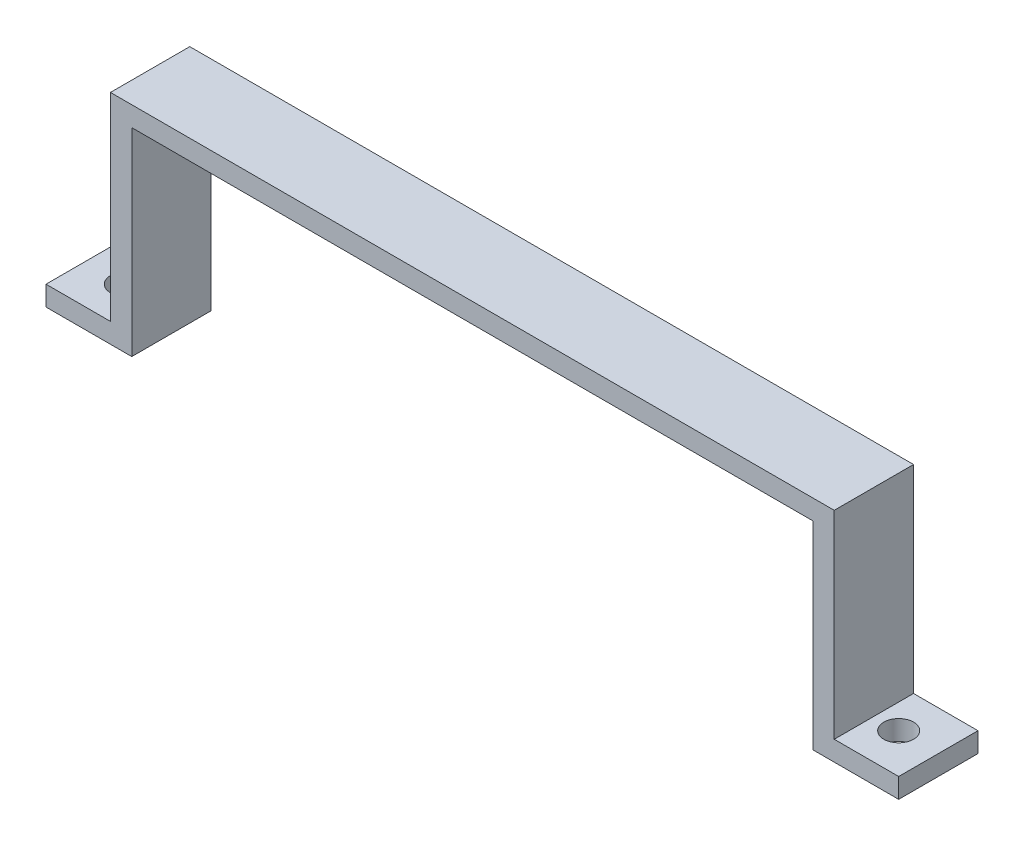
ISO-10303-21;
HEADER;
FILE_DESCRIPTION(('STEP AP214'),'2;1');
FILE_NAME('part.step','',(''),(''),'','','');
FILE_SCHEMA(('AUTOMOTIVE_DESIGN { 1 0 10303 214 1 1 1 1 }'));
ENDSEC;
DATA;
#1=APPLICATION_CONTEXT('core data for automotive mechanical design processes');
#2=APPLICATION_PROTOCOL_DEFINITION('international standard','automotive_design',2000,#1);
#3=PRODUCT_CONTEXT('',#1,'mechanical');
#4=PRODUCT('Part','Part','',(#3));
#5=PRODUCT_RELATED_PRODUCT_CATEGORY('part','',(#4));
#6=PRODUCT_DEFINITION_FORMATION('','',#4);
#7=PRODUCT_DEFINITION_CONTEXT('part definition',#1,'design');
#8=PRODUCT_DEFINITION('design','',#6,#7);
#9=PRODUCT_DEFINITION_SHAPE('','',#8);
#10=(LENGTH_UNIT() NAMED_UNIT(*) SI_UNIT(.MILLI.,.METRE.));
#11=(NAMED_UNIT(*) PLANE_ANGLE_UNIT() SI_UNIT($,.RADIAN.));
#12=(NAMED_UNIT(*) SI_UNIT($,.STERADIAN.) SOLID_ANGLE_UNIT());
#13=UNCERTAINTY_MEASURE_WITH_UNIT(LENGTH_MEASURE(1.E-05),#10,'distance_accuracy_value','');
#14=(GEOMETRIC_REPRESENTATION_CONTEXT(3) GLOBAL_UNCERTAINTY_ASSIGNED_CONTEXT((#13)) GLOBAL_UNIT_ASSIGNED_CONTEXT((#10,
#11,#12)) REPRESENTATION_CONTEXT('',''));
#15=CARTESIAN_POINT('',(0.,0.,0.));
#16=DIRECTION('',(0.,0.,1.));
#17=DIRECTION('',(1.,0.,0.));
#18=AXIS2_PLACEMENT_3D('',#15,#16,#17);
#19=CARTESIAN_POINT('',(0.,0.,0.));
#20=DIRECTION('',(0.,-1.,0.));
#21=DIRECTION('',(0.,0.,-1.));
#22=AXIS2_PLACEMENT_3D('',#19,#20,#21);
#23=PLANE('',#22);
#24=DIRECTION('',(1.,0.,0.));
#25=VECTOR('',#24,1.);
#26=CARTESIAN_POINT('',(-36.5,0.,-4.));
#27=LINE('',#26,#25);
#28=CARTESIAN_POINT('',(-34.35,0.,-4.));
#29=VERTEX_POINT('',#28);
#30=CARTESIAN_POINT('',(34.35,0.,-4.));
#31=VERTEX_POINT('',#30);
#32=EDGE_CURVE('E245',#29,#31,#27,.T.);
#33=ORIENTED_EDGE('',*,*,#32,.T.);
#34=DIRECTION('',(0.,0.,-1.));
#35=VECTOR('',#34,1.);
#36=CARTESIAN_POINT('',(34.35,0.,0.));
#37=LINE('',#36,#35);
#38=CARTESIAN_POINT('',(34.35,0.,4.));
#39=VERTEX_POINT('',#38);
#40=EDGE_CURVE('E215',#39,#31,#37,.T.);
#41=ORIENTED_EDGE('',*,*,#40,.F.);
#42=DIRECTION('',(1.,0.,0.));
#43=VECTOR('',#42,1.);
#44=CARTESIAN_POINT('',(-36.5,0.,4.));
#45=LINE('',#44,#43);
#46=CARTESIAN_POINT('',(-34.35,0.,4.));
#47=VERTEX_POINT('',#46);
#48=EDGE_CURVE('E252',#47,#39,#45,.T.);
#49=ORIENTED_EDGE('',*,*,#48,.F.);
#50=DIRECTION('',(0.,0.,1.));
#51=VECTOR('',#50,1.);
#52=CARTESIAN_POINT('',(-34.35,0.,0.));
#53=LINE('',#52,#51);
#54=EDGE_CURVE('E230',#29,#47,#53,.T.);
#55=ORIENTED_EDGE('',*,*,#54,.F.);
#56=EDGE_LOOP('',(#33,#41,#49,#55));
#57=FACE_BOUND('',#56,.T.);
#58=ADVANCED_FACE('F69',(#57),#23,.T.);
#59=CARTESIAN_POINT('',(-36.5,2.,4.));
#60=DIRECTION('',(-1.,0.,0.));
#61=DIRECTION('',(0.,0.,1.));
#62=AXIS2_PLACEMENT_3D('',#59,#60,#61);
#63=PLANE('',#62);
#64=DIRECTION('',(0.,0.,-1.));
#65=VECTOR('',#64,1.);
#66=CARTESIAN_POINT('',(-36.5,-18.,0.));
#67=LINE('',#66,#65);
#68=CARTESIAN_POINT('',(-36.5,-18.,4.));
#69=VERTEX_POINT('',#68);
#70=CARTESIAN_POINT('',(-36.5,-18.,-4.));
#71=VERTEX_POINT('',#70);
#72=EDGE_CURVE('E94',#69,#71,#67,.T.);
#73=ORIENTED_EDGE('',*,*,#72,.F.);
#74=DIRECTION('',(0.,-1.,0.));
#75=VECTOR('',#74,1.);
#76=CARTESIAN_POINT('',(-36.5,2.,4.));
#77=LINE('',#76,#75);
#78=CARTESIAN_POINT('',(-36.5,2.,4.));
#79=VERTEX_POINT('',#78);
#80=EDGE_CURVE('E12',#79,#69,#77,.T.);
#81=ORIENTED_EDGE('',*,*,#80,.F.);
#82=DIRECTION('',(0.,0.,-1.));
#83=VECTOR('',#82,1.);
#84=CARTESIAN_POINT('',(-36.5,2.,4.));
#85=LINE('',#84,#83);
#86=CARTESIAN_POINT('',(-36.5,2.,-4.));
#87=VERTEX_POINT('',#86);
#88=EDGE_CURVE('E248',#79,#87,#85,.T.);
#89=ORIENTED_EDGE('',*,*,#88,.T.);
#90=DIRECTION('',(0.,-1.,0.));
#91=VECTOR('',#90,1.);
#92=CARTESIAN_POINT('',(-36.5,2.,-4.));
#93=LINE('',#92,#91);
#94=EDGE_CURVE('E73',#87,#71,#93,.T.);
#95=ORIENTED_EDGE('',*,*,#94,.T.);
#96=EDGE_LOOP('',(#73,#81,#89,#95));
#97=FACE_BOUND('',#96,.T.);
#98=ADVANCED_FACE('F71',(#97),#63,.T.);
#99=CARTESIAN_POINT('',(-36.5,2.,4.));
#100=DIRECTION('',(0.,0.,-1.));
#101=DIRECTION('',(-1.,0.,0.));
#102=AXIS2_PLACEMENT_3D('',#99,#100,#101);
#103=PLANE('',#102);
#104=ORIENTED_EDGE('',*,*,#80,.T.);
#105=DIRECTION('',(1.,0.,0.));
#106=VECTOR('',#105,1.);
#107=CARTESIAN_POINT('',(0.,-18.,4.));
#108=LINE('',#107,#106);
#109=CARTESIAN_POINT('',(-43.,-18.,4.));
#110=VERTEX_POINT('',#109);
#111=EDGE_CURVE('E204',#110,#69,#108,.T.);
#112=ORIENTED_EDGE('',*,*,#111,.F.);
#113=DIRECTION('',(0.,-1.,0.));
#114=VECTOR('',#113,1.);
#115=CARTESIAN_POINT('',(-43.,-18.,4.));
#116=LINE('',#115,#114);
#117=CARTESIAN_POINT('',(-43.,-20.,4.));
#118=VERTEX_POINT('',#117);
#119=EDGE_CURVE('E209',#110,#118,#116,.T.);
#120=ORIENTED_EDGE('',*,*,#119,.T.);
#121=DIRECTION('',(1.,0.,0.));
#122=VECTOR('',#121,1.);
#123=CARTESIAN_POINT('',(0.,-20.,4.));
#124=LINE('',#123,#122);
#125=CARTESIAN_POINT('',(-34.35,-20.,4.));
#126=VERTEX_POINT('',#125);
#127=EDGE_CURVE('E236',#118,#126,#124,.T.);
#128=ORIENTED_EDGE('',*,*,#127,.T.);
#129=DIRECTION('',(0.,1.,0.));
#130=VECTOR('',#129,1.);
#131=CARTESIAN_POINT('',(-34.35,-20.,4.));
#132=LINE('',#131,#130);
#133=EDGE_CURVE('E242',#126,#47,#132,.T.);
#134=ORIENTED_EDGE('',*,*,#133,.T.);
#135=ORIENTED_EDGE('',*,*,#48,.T.);
#136=DIRECTION('',(0.,1.,0.));
#137=VECTOR('',#136,1.);
#138=CARTESIAN_POINT('',(34.35,-20.,4.));
#139=LINE('',#138,#137);
#140=CARTESIAN_POINT('',(34.35,-20.,4.));
#141=VERTEX_POINT('',#140);
#142=EDGE_CURVE('E225',#141,#39,#139,.T.);
#143=ORIENTED_EDGE('',*,*,#142,.F.);
#144=DIRECTION('',(1.,0.,0.));
#145=VECTOR('',#144,1.);
#146=CARTESIAN_POINT('',(0.,-20.,4.));
#147=LINE('',#146,#145);
#148=CARTESIAN_POINT('',(43.,-20.,4.));
#149=VERTEX_POINT('',#148);
#150=EDGE_CURVE('E221',#141,#149,#147,.T.);
#151=ORIENTED_EDGE('',*,*,#150,.T.);
#152=DIRECTION('',(0.,-1.,0.));
#153=VECTOR('',#152,1.);
#154=CARTESIAN_POINT('',(43.,-18.,4.));
#155=LINE('',#154,#153);
#156=CARTESIAN_POINT('',(43.,-18.,4.));
#157=VERTEX_POINT('',#156);
#158=EDGE_CURVE('E174',#157,#149,#155,.T.);
#159=ORIENTED_EDGE('',*,*,#158,.F.);
#160=DIRECTION('',(1.,0.,0.));
#161=VECTOR('',#160,1.);
#162=CARTESIAN_POINT('',(0.,-18.,4.));
#163=LINE('',#162,#161);
#164=CARTESIAN_POINT('',(36.5,-18.,4.));
#165=VERTEX_POINT('',#164);
#166=EDGE_CURVE('E162',#165,#157,#163,.T.);
#167=ORIENTED_EDGE('',*,*,#166,.F.);
#168=DIRECTION('',(0.,-1.,0.));
#169=VECTOR('',#168,1.);
#170=CARTESIAN_POINT('',(36.5,2.,4.));
#171=LINE('',#170,#169);
#172=CARTESIAN_POINT('',(36.5,2.,4.));
#173=VERTEX_POINT('',#172);
#174=EDGE_CURVE('E78',#173,#165,#171,.T.);
#175=ORIENTED_EDGE('',*,*,#174,.F.);
#176=DIRECTION('',(1.,0.,0.));
#177=VECTOR('',#176,1.);
#178=CARTESIAN_POINT('',(-36.5,2.,4.));
#179=LINE('',#178,#177);
#180=EDGE_CURVE('E256',#79,#173,#179,.T.);
#181=ORIENTED_EDGE('',*,*,#180,.F.);
#182=EDGE_LOOP('',(#104,#112,#120,#128,#134,#135,#143,#151,#159,#167,#175,#181));
#183=FACE_BOUND('',#182,.T.);
#184=ADVANCED_FACE('F277',(#183),#103,.F.);
#185=CARTESIAN_POINT('',(36.5,2.,4.));
#186=DIRECTION('',(-1.,0.,0.));
#187=DIRECTION('',(0.,0.,1.));
#188=AXIS2_PLACEMENT_3D('',#185,#186,#187);
#189=PLANE('',#188);
#190=ORIENTED_EDGE('',*,*,#174,.T.);
#191=DIRECTION('',(0.,0.,-1.));
#192=VECTOR('',#191,1.);
#193=CARTESIAN_POINT('',(36.5,-18.,0.));
#194=LINE('',#193,#192);
#195=CARTESIAN_POINT('',(36.5,-18.,-4.));
#196=VERTEX_POINT('',#195);
#197=EDGE_CURVE('E175',#165,#196,#194,.T.);
#198=ORIENTED_EDGE('',*,*,#197,.T.);
#199=DIRECTION('',(0.,-1.,0.));
#200=VECTOR('',#199,1.);
#201=CARTESIAN_POINT('',(36.5,2.,-4.));
#202=LINE('',#201,#200);
#203=CARTESIAN_POINT('',(36.5,2.,-4.));
#204=VERTEX_POINT('',#203);
#205=EDGE_CURVE('E182',#204,#196,#202,.T.);
#206=ORIENTED_EDGE('',*,*,#205,.F.);
#207=DIRECTION('',(0.,0.,-1.));
#208=VECTOR('',#207,1.);
#209=CARTESIAN_POINT('',(36.5,2.,4.));
#210=LINE('',#209,#208);
#211=EDGE_CURVE('E254',#173,#204,#210,.T.);
#212=ORIENTED_EDGE('',*,*,#211,.F.);
#213=EDGE_LOOP('',(#190,#198,#206,#212));
#214=FACE_BOUND('',#213,.T.);
#215=ADVANCED_FACE('F284',(#214),#189,.F.);
#216=CARTESIAN_POINT('',(-36.5,2.,-4.));
#217=DIRECTION('',(0.,0.,-1.));
#218=DIRECTION('',(-1.,0.,0.));
#219=AXIS2_PLACEMENT_3D('',#216,#217,#218);
#220=PLANE('',#219);
#221=ORIENTED_EDGE('',*,*,#32,.F.);
#222=DIRECTION('',(0.,1.,0.));
#223=VECTOR('',#222,1.);
#224=CARTESIAN_POINT('',(-34.35,-20.,-4.));
#225=LINE('',#224,#223);
#226=CARTESIAN_POINT('',(-34.35,-20.,-4.));
#227=VERTEX_POINT('',#226);
#228=EDGE_CURVE('E239',#227,#29,#225,.T.);
#229=ORIENTED_EDGE('',*,*,#228,.F.);
#230=DIRECTION('',(1.,0.,0.));
#231=VECTOR('',#230,1.);
#232=CARTESIAN_POINT('',(0.,-20.,-4.));
#233=LINE('',#232,#231);
#234=CARTESIAN_POINT('',(-43.,-20.,-4.));
#235=VERTEX_POINT('',#234);
#236=EDGE_CURVE('E234',#235,#227,#233,.T.);
#237=ORIENTED_EDGE('',*,*,#236,.F.);
#238=DIRECTION('',(0.,-1.,0.));
#239=VECTOR('',#238,1.);
#240=CARTESIAN_POINT('',(-43.,-18.,-4.));
#241=LINE('',#240,#239);
#242=CARTESIAN_POINT('',(-43.,-18.,-4.));
#243=VERTEX_POINT('',#242);
#244=EDGE_CURVE('E212',#243,#235,#241,.T.);
#245=ORIENTED_EDGE('',*,*,#244,.F.);
#246=DIRECTION('',(1.,0.,0.));
#247=VECTOR('',#246,1.);
#248=CARTESIAN_POINT('',(0.,-18.,-4.));
#249=LINE('',#248,#247);
#250=EDGE_CURVE('E200',#243,#71,#249,.T.);
#251=ORIENTED_EDGE('',*,*,#250,.T.);
#252=ORIENTED_EDGE('',*,*,#94,.F.);
#253=DIRECTION('',(1.,0.,0.));
#254=VECTOR('',#253,1.);
#255=CARTESIAN_POINT('',(-36.5,2.,-4.));
#256=LINE('',#255,#254);
#257=EDGE_CURVE('E251',#87,#204,#256,.T.);
#258=ORIENTED_EDGE('',*,*,#257,.T.);
#259=ORIENTED_EDGE('',*,*,#205,.T.);
#260=DIRECTION('',(1.,0.,0.));
#261=VECTOR('',#260,1.);
#262=CARTESIAN_POINT('',(0.,-18.,-4.));
#263=LINE('',#262,#261);
#264=CARTESIAN_POINT('',(43.,-18.,-4.));
#265=VERTEX_POINT('',#264);
#266=EDGE_CURVE('E86',#196,#265,#263,.T.);
#267=ORIENTED_EDGE('',*,*,#266,.T.);
#268=DIRECTION('',(0.,-1.,0.));
#269=VECTOR('',#268,1.);
#270=CARTESIAN_POINT('',(43.,-18.,-4.));
#271=LINE('',#270,#269);
#272=CARTESIAN_POINT('',(43.,-20.,-4.));
#273=VERTEX_POINT('',#272);
#274=EDGE_CURVE('E169',#265,#273,#271,.T.);
#275=ORIENTED_EDGE('',*,*,#274,.T.);
#276=DIRECTION('',(1.,0.,0.));
#277=VECTOR('',#276,1.);
#278=CARTESIAN_POINT('',(0.,-20.,-4.));
#279=LINE('',#278,#277);
#280=CARTESIAN_POINT('',(34.35,-20.,-4.));
#281=VERTEX_POINT('',#280);
#282=EDGE_CURVE('E223',#281,#273,#279,.T.);
#283=ORIENTED_EDGE('',*,*,#282,.F.);
#284=DIRECTION('',(0.,1.,0.));
#285=VECTOR('',#284,1.);
#286=CARTESIAN_POINT('',(34.35,-20.,-4.));
#287=LINE('',#286,#285);
#288=EDGE_CURVE('E228',#281,#31,#287,.T.);
#289=ORIENTED_EDGE('',*,*,#288,.T.);
#290=EDGE_LOOP('',(#221,#229,#237,#245,#251,#252,#258,#259,#267,#275,#283,#289));
#291=FACE_BOUND('',#290,.T.);
#292=ADVANCED_FACE('F179',(#291),#220,.T.);
#293=CARTESIAN_POINT('',(0.,2.,0.));
#294=DIRECTION('',(0.,-1.,0.));
#295=DIRECTION('',(0.,0.,-1.));
#296=AXIS2_PLACEMENT_3D('',#293,#294,#295);
#297=PLANE('',#296);
#298=ORIENTED_EDGE('',*,*,#88,.F.);
#299=ORIENTED_EDGE('',*,*,#180,.T.);
#300=ORIENTED_EDGE('',*,*,#211,.T.);
#301=ORIENTED_EDGE('',*,*,#257,.F.);
#302=EDGE_LOOP('',(#298,#299,#300,#301));
#303=FACE_BOUND('',#302,.T.);
#304=ADVANCED_FACE('F282',(#303),#297,.F.);
#305=CARTESIAN_POINT('',(-34.35,-20.,0.));
#306=DIRECTION('',(-1.,0.,0.));
#307=DIRECTION('',(0.,0.,1.));
#308=AXIS2_PLACEMENT_3D('',#305,#306,#307);
#309=PLANE('',#308);
#310=ORIENTED_EDGE('',*,*,#54,.T.);
#311=ORIENTED_EDGE('',*,*,#133,.F.);
#312=DIRECTION('',(0.,0.,1.));
#313=VECTOR('',#312,1.);
#314=CARTESIAN_POINT('',(-34.35,-20.,0.));
#315=LINE('',#314,#313);
#316=EDGE_CURVE('E232',#227,#126,#315,.T.);
#317=ORIENTED_EDGE('',*,*,#316,.F.);
#318=ORIENTED_EDGE('',*,*,#228,.T.);
#319=EDGE_LOOP('',(#310,#311,#317,#318));
#320=FACE_BOUND('',#319,.T.);
#321=ADVANCED_FACE('F301',(#320),#309,.F.);
#322=CARTESIAN_POINT('',(0.,-20.,0.));
#323=DIRECTION('',(0.,1.,0.));
#324=DIRECTION('',(0.,0.,1.));
#325=AXIS2_PLACEMENT_3D('',#322,#323,#324);
#326=PLANE('',#325);
#327=ORIENTED_EDGE('',*,*,#316,.T.);
#328=ORIENTED_EDGE('',*,*,#127,.F.);
#329=DIRECTION('',(0.,0.,1.));
#330=VECTOR('',#329,1.);
#331=CARTESIAN_POINT('',(-43.,-20.,0.));
#332=LINE('',#331,#330);
#333=EDGE_CURVE('E197',#235,#118,#332,.T.);
#334=ORIENTED_EDGE('',*,*,#333,.F.);
#335=ORIENTED_EDGE('',*,*,#236,.T.);
#336=EDGE_LOOP('',(#327,#328,#334,#335));
#337=FACE_BOUND('',#336,.T.);
#338=CARTESIAN_POINT('',(-39.,-20.,0.));
#339=DIRECTION('',(0.,1.,0.));
#340=DIRECTION('',(0.,0.,1.));
#341=AXIS2_PLACEMENT_3D('',#338,#339,#340);
#342=CIRCLE('',#341,1.5);
#343=CARTESIAN_POINT('',(-39.,-20.,1.50000000000001));
#344=VERTEX_POINT('',#343);
#345=EDGE_CURVE('E192',#344,#344,#342,.T.);
#346=ORIENTED_EDGE('',*,*,#345,.T.);
#347=EDGE_LOOP('',(#346));
#348=FACE_BOUND('',#347,.T.);
#349=ADVANCED_FACE('F304',(#337,#348),#326,.F.);
#350=CARTESIAN_POINT('',(34.35,-20.,0.));
#351=DIRECTION('',(1.,0.,0.));
#352=DIRECTION('',(0.,0.,-1.));
#353=AXIS2_PLACEMENT_3D('',#350,#351,#352);
#354=PLANE('',#353);
#355=ORIENTED_EDGE('',*,*,#40,.T.);
#356=ORIENTED_EDGE('',*,*,#288,.F.);
#357=DIRECTION('',(0.,0.,-1.));
#358=VECTOR('',#357,1.);
#359=CARTESIAN_POINT('',(34.35,-20.,0.));
#360=LINE('',#359,#358);
#361=EDGE_CURVE('E218',#141,#281,#360,.T.);
#362=ORIENTED_EDGE('',*,*,#361,.F.);
#363=ORIENTED_EDGE('',*,*,#142,.T.);
#364=EDGE_LOOP('',(#355,#356,#362,#363));
#365=FACE_BOUND('',#364,.T.);
#366=ADVANCED_FACE('F308',(#365),#354,.F.);
#367=CARTESIAN_POINT('',(0.,-20.,0.));
#368=DIRECTION('',(0.,1.,0.));
#369=DIRECTION('',(0.,0.,1.));
#370=AXIS2_PLACEMENT_3D('',#367,#368,#369);
#371=PLANE('',#370);
#372=ORIENTED_EDGE('',*,*,#361,.T.);
#373=ORIENTED_EDGE('',*,*,#282,.T.);
#374=DIRECTION('',(0.,0.,-1.));
#375=VECTOR('',#374,1.);
#376=CARTESIAN_POINT('',(43.,-20.,0.));
#377=LINE('',#376,#375);
#378=EDGE_CURVE('E172',#149,#273,#377,.T.);
#379=ORIENTED_EDGE('',*,*,#378,.F.);
#380=ORIENTED_EDGE('',*,*,#150,.F.);
#381=EDGE_LOOP('',(#372,#373,#379,#380));
#382=FACE_BOUND('',#381,.T.);
#383=CARTESIAN_POINT('',(39.,-20.,0.));
#384=DIRECTION('',(0.,1.,0.));
#385=DIRECTION('',(0.,0.,1.));
#386=AXIS2_PLACEMENT_3D('',#383,#384,#385);
#387=CIRCLE('',#386,1.5);
#388=CARTESIAN_POINT('',(39.,-20.,1.5));
#389=VERTEX_POINT('',#388);
#390=EDGE_CURVE('E187',#389,#389,#387,.T.);
#391=ORIENTED_EDGE('',*,*,#390,.T.);
#392=EDGE_LOOP('',(#391));
#393=FACE_BOUND('',#392,.T.);
#394=ADVANCED_FACE('F312',(#382,#393),#371,.F.);
#395=CARTESIAN_POINT('',(0.,-18.,0.));
#396=DIRECTION('',(0.,1.,0.));
#397=DIRECTION('',(0.,0.,1.));
#398=AXIS2_PLACEMENT_3D('',#395,#396,#397);
#399=PLANE('',#398);
#400=ORIENTED_EDGE('',*,*,#250,.F.);
#401=DIRECTION('',(0.,0.,1.));
#402=VECTOR('',#401,1.);
#403=CARTESIAN_POINT('',(-43.,-18.,0.));
#404=LINE('',#403,#402);
#405=EDGE_CURVE('E207',#243,#110,#404,.T.);
#406=ORIENTED_EDGE('',*,*,#405,.T.);
#407=ORIENTED_EDGE('',*,*,#111,.T.);
#408=ORIENTED_EDGE('',*,*,#72,.T.);
#409=EDGE_LOOP('',(#400,#406,#407,#408));
#410=FACE_BOUND('',#409,.T.);
#411=CARTESIAN_POINT('',(-39.,-18.,0.));
#412=DIRECTION('',(0.,1.,0.));
#413=DIRECTION('',(0.,0.,1.));
#414=AXIS2_PLACEMENT_3D('',#411,#412,#413);
#415=CIRCLE('',#414,1.5);
#416=CARTESIAN_POINT('',(-39.,-18.,1.50000000000001));
#417=VERTEX_POINT('',#416);
#418=EDGE_CURVE('E194',#417,#417,#415,.T.);
#419=ORIENTED_EDGE('',*,*,#418,.F.);
#420=EDGE_LOOP('',(#419));
#421=FACE_BOUND('',#420,.T.);
#422=ADVANCED_FACE('F267',(#410,#421),#399,.T.);
#423=CARTESIAN_POINT('',(-43.,-18.,0.));
#424=DIRECTION('',(1.,0.,0.));
#425=DIRECTION('',(0.,0.,-1.));
#426=AXIS2_PLACEMENT_3D('',#423,#424,#425);
#427=PLANE('',#426);
#428=ORIENTED_EDGE('',*,*,#333,.T.);
#429=ORIENTED_EDGE('',*,*,#119,.F.);
#430=ORIENTED_EDGE('',*,*,#405,.F.);
#431=ORIENTED_EDGE('',*,*,#244,.T.);
#432=EDGE_LOOP('',(#428,#429,#430,#431));
#433=FACE_BOUND('',#432,.T.);
#434=ADVANCED_FACE('F275',(#433),#427,.F.);
#435=CARTESIAN_POINT('',(-39.,-18.,0.));
#436=DIRECTION('',(0.,-1.,0.));
#437=DIRECTION('',(0.,0.,-1.));
#438=AXIS2_PLACEMENT_3D('',#435,#436,#437);
#439=CYLINDRICAL_SURFACE('',#438,1.5);
#440=ORIENTED_EDGE('',*,*,#418,.T.);
#441=EDGE_LOOP('',(#440));
#442=FACE_BOUND('',#441,.T.);
#443=ORIENTED_EDGE('',*,*,#345,.F.);
#444=EDGE_LOOP('',(#443));
#445=FACE_BOUND('',#444,.T.);
#446=ADVANCED_FACE('F319',(#442,#445),#439,.F.);
#447=CARTESIAN_POINT('',(0.,-18.,0.));
#448=DIRECTION('',(0.,1.,0.));
#449=DIRECTION('',(0.,0.,1.));
#450=AXIS2_PLACEMENT_3D('',#447,#448,#449);
#451=PLANE('',#450);
#452=ORIENTED_EDGE('',*,*,#266,.F.);
#453=ORIENTED_EDGE('',*,*,#197,.F.);
#454=ORIENTED_EDGE('',*,*,#166,.T.);
#455=DIRECTION('',(0.,0.,-1.));
#456=VECTOR('',#455,1.);
#457=CARTESIAN_POINT('',(43.,-18.,0.));
#458=LINE('',#457,#456);
#459=EDGE_CURVE('E158',#157,#265,#458,.T.);
#460=ORIENTED_EDGE('',*,*,#459,.T.);
#461=EDGE_LOOP('',(#452,#453,#454,#460));
#462=FACE_BOUND('',#461,.T.);
#463=CARTESIAN_POINT('',(39.,-18.,0.));
#464=DIRECTION('',(0.,1.,0.));
#465=DIRECTION('',(0.,0.,1.));
#466=AXIS2_PLACEMENT_3D('',#463,#464,#465);
#467=CIRCLE('',#466,1.5);
#468=CARTESIAN_POINT('',(39.,-18.,1.5));
#469=VERTEX_POINT('',#468);
#470=EDGE_CURVE('E184',#469,#469,#467,.T.);
#471=ORIENTED_EDGE('',*,*,#470,.F.);
#472=EDGE_LOOP('',(#471));
#473=FACE_BOUND('',#472,.T.);
#474=ADVANCED_FACE('F160',(#462,#473),#451,.T.);
#475=CARTESIAN_POINT('',(43.,-18.,0.));
#476=DIRECTION('',(-1.,0.,0.));
#477=DIRECTION('',(0.,0.,1.));
#478=AXIS2_PLACEMENT_3D('',#475,#476,#477);
#479=PLANE('',#478);
#480=ORIENTED_EDGE('',*,*,#378,.T.);
#481=ORIENTED_EDGE('',*,*,#274,.F.);
#482=ORIENTED_EDGE('',*,*,#459,.F.);
#483=ORIENTED_EDGE('',*,*,#158,.T.);
#484=EDGE_LOOP('',(#480,#481,#482,#483));
#485=FACE_BOUND('',#484,.T.);
#486=ADVANCED_FACE('F170',(#485),#479,.F.);
#487=CARTESIAN_POINT('',(39.,-18.,0.));
#488=DIRECTION('',(0.,-1.,0.));
#489=DIRECTION('',(0.,0.,-1.));
#490=AXIS2_PLACEMENT_3D('',#487,#488,#489);
#491=CYLINDRICAL_SURFACE('',#490,1.5);
#492=ORIENTED_EDGE('',*,*,#470,.T.);
#493=EDGE_LOOP('',(#492));
#494=FACE_BOUND('',#493,.T.);
#495=ORIENTED_EDGE('',*,*,#390,.F.);
#496=EDGE_LOOP('',(#495));
#497=FACE_BOUND('',#496,.T.);
#498=ADVANCED_FACE('F327',(#494,#497),#491,.F.);
#499=CLOSED_SHELL('',(#58,#98,#184,#215,#292,#304,#321,#349,#366,#394,#422,#434,#446,#474,#486,#498));
#500=MANIFOLD_SOLID_BREP('B2',#499);
#501=ADVANCED_BREP_SHAPE_REPRESENTATION('',(#18,#500),#14);
#502=SHAPE_DEFINITION_REPRESENTATION(#9,#501);
ENDSEC;
END-ISO-10303-21;
